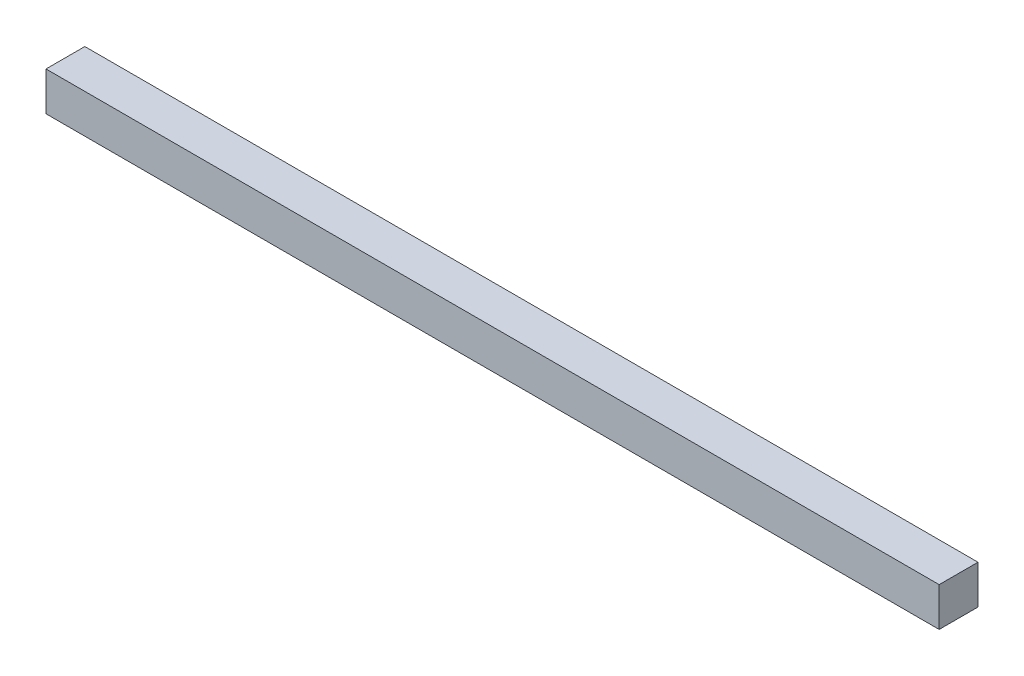
ISO-10303-21;
HEADER;
FILE_DESCRIPTION(('STEP AP214'),'2;1');
FILE_NAME('part.step','',(''),(''),'','','');
FILE_SCHEMA(('AUTOMOTIVE_DESIGN { 1 0 10303 214 1 1 1 1 }'));
ENDSEC;
DATA;
#1=APPLICATION_CONTEXT('core data for automotive mechanical design processes');
#2=APPLICATION_PROTOCOL_DEFINITION('international standard','automotive_design',2000,#1);
#3=PRODUCT_CONTEXT('',#1,'mechanical');
#4=PRODUCT('Part','Part','',(#3));
#5=PRODUCT_RELATED_PRODUCT_CATEGORY('part','',(#4));
#6=PRODUCT_DEFINITION_FORMATION('','',#4);
#7=PRODUCT_DEFINITION_CONTEXT('part definition',#1,'design');
#8=PRODUCT_DEFINITION('design','',#6,#7);
#9=PRODUCT_DEFINITION_SHAPE('','',#8);
#10=(LENGTH_UNIT() NAMED_UNIT(*) SI_UNIT(.MILLI.,.METRE.));
#11=(NAMED_UNIT(*) PLANE_ANGLE_UNIT() SI_UNIT($,.RADIAN.));
#12=(NAMED_UNIT(*) SI_UNIT($,.STERADIAN.) SOLID_ANGLE_UNIT());
#13=UNCERTAINTY_MEASURE_WITH_UNIT(LENGTH_MEASURE(1.E-05),#10,'distance_accuracy_value','');
#14=(GEOMETRIC_REPRESENTATION_CONTEXT(3) GLOBAL_UNCERTAINTY_ASSIGNED_CONTEXT((#13)) GLOBAL_UNIT_ASSIGNED_CONTEXT((#10,
#11,#12)) REPRESENTATION_CONTEXT('',''));
#15=CARTESIAN_POINT('',(0.,0.,0.));
#16=DIRECTION('',(0.,0.,1.));
#17=DIRECTION('',(1.,0.,0.));
#18=AXIS2_PLACEMENT_3D('',#15,#16,#17);
#19=CARTESIAN_POINT('',(44.0503208682354,37.6310916584124,30.));
#20=DIRECTION('',(1.,0.,0.));
#21=DIRECTION('',(0.,0.,-1.));
#22=AXIS2_PLACEMENT_3D('',#19,#20,#21);
#23=PLANE('',#22);
#24=DIRECTION('',(0.,-1.,0.));
#25=VECTOR('',#24,1.);
#26=CARTESIAN_POINT('',(44.0503208682354,37.6310916584124,0.));
#27=LINE('',#26,#25);
#28=CARTESIAN_POINT('',(44.0503208682354,37.6310916584124,0.));
#29=VERTEX_POINT('',#28);
#30=CARTESIAN_POINT('',(44.0503208682354,7.63109165841235,0.));
#31=VERTEX_POINT('',#30);
#32=EDGE_CURVE('E107',#29,#31,#27,.T.);
#33=ORIENTED_EDGE('',*,*,#32,.T.);
#34=DIRECTION('',(0.,0.,-1.));
#35=VECTOR('',#34,1.);
#36=CARTESIAN_POINT('',(44.0503208682354,7.63109165841235,30.));
#37=LINE('',#36,#35);
#38=CARTESIAN_POINT('',(44.0503208682354,7.63109165841235,30.));
#39=VERTEX_POINT('',#38);
#40=EDGE_CURVE('E11',#39,#31,#37,.T.);
#41=ORIENTED_EDGE('',*,*,#40,.F.);
#42=DIRECTION('',(0.,-1.,0.));
#43=VECTOR('',#42,1.);
#44=CARTESIAN_POINT('',(44.0503208682354,37.6310916584124,30.));
#45=LINE('',#44,#43);
#46=CARTESIAN_POINT('',(44.0503208682354,37.6310916584124,30.));
#47=VERTEX_POINT('',#46);
#48=EDGE_CURVE('E91',#47,#39,#45,.T.);
#49=ORIENTED_EDGE('',*,*,#48,.F.);
#50=DIRECTION('',(0.,0.,-1.));
#51=VECTOR('',#50,1.);
#52=CARTESIAN_POINT('',(44.0503208682354,37.6310916584124,30.));
#53=LINE('',#52,#51);
#54=EDGE_CURVE('E103',#47,#29,#53,.T.);
#55=ORIENTED_EDGE('',*,*,#54,.T.);
#56=EDGE_LOOP('',(#33,#41,#49,#55));
#57=FACE_BOUND('',#56,.T.);
#58=ADVANCED_FACE('F39',(#57),#23,.F.);
#59=CARTESIAN_POINT('',(44.0503208682354,7.63109165841235,30.));
#60=DIRECTION('',(0.,1.,0.));
#61=DIRECTION('',(0.,0.,1.));
#62=AXIS2_PLACEMENT_3D('',#59,#60,#61);
#63=PLANE('',#62);
#64=DIRECTION('',(1.,0.,0.));
#65=VECTOR('',#64,1.);
#66=CARTESIAN_POINT('',(44.0503208682354,7.63109165841235,0.));
#67=LINE('',#66,#65);
#68=CARTESIAN_POINT('',(734.050320868235,7.63109165841235,0.));
#69=VERTEX_POINT('',#68);
#70=EDGE_CURVE('E96',#31,#69,#67,.T.);
#71=ORIENTED_EDGE('',*,*,#70,.T.);
#72=DIRECTION('',(0.,0.,-1.));
#73=VECTOR('',#72,1.);
#74=CARTESIAN_POINT('',(734.050320868235,7.63109165841235,30.));
#75=LINE('',#74,#73);
#76=CARTESIAN_POINT('',(734.050320868235,7.63109165841235,30.));
#77=VERTEX_POINT('',#76);
#78=EDGE_CURVE('E48',#77,#69,#75,.T.);
#79=ORIENTED_EDGE('',*,*,#78,.F.);
#80=DIRECTION('',(1.,0.,0.));
#81=VECTOR('',#80,1.);
#82=CARTESIAN_POINT('',(44.0503208682354,7.63109165841235,30.));
#83=LINE('',#82,#81);
#84=EDGE_CURVE('E86',#39,#77,#83,.T.);
#85=ORIENTED_EDGE('',*,*,#84,.F.);
#86=ORIENTED_EDGE('',*,*,#40,.T.);
#87=EDGE_LOOP('',(#71,#79,#85,#86));
#88=FACE_BOUND('',#87,.T.);
#89=ADVANCED_FACE('F95',(#88),#63,.F.);
#90=CARTESIAN_POINT('',(734.050320868235,37.6310916584124,30.));
#91=DIRECTION('',(-1.,0.,0.));
#92=DIRECTION('',(0.,-1.,0.));
#93=AXIS2_PLACEMENT_3D('',#90,#91,#92);
#94=PLANE('',#93);
#95=DIRECTION('',(0.,1.,0.));
#96=VECTOR('',#95,1.);
#97=CARTESIAN_POINT('',(734.050320868235,37.6310916584124,0.));
#98=LINE('',#97,#96);
#99=CARTESIAN_POINT('',(734.050320868235,37.6310916584124,0.));
#100=VERTEX_POINT('',#99);
#101=EDGE_CURVE('E73',#69,#100,#98,.T.);
#102=ORIENTED_EDGE('',*,*,#101,.T.);
#103=DIRECTION('',(0.,0.,-1.));
#104=VECTOR('',#103,1.);
#105=CARTESIAN_POINT('',(734.050320868235,37.6310916584124,30.));
#106=LINE('',#105,#104);
#107=CARTESIAN_POINT('',(734.050320868235,37.6310916584124,30.));
#108=VERTEX_POINT('',#107);
#109=EDGE_CURVE('E98',#108,#100,#106,.T.);
#110=ORIENTED_EDGE('',*,*,#109,.F.);
#111=DIRECTION('',(0.,1.,0.));
#112=VECTOR('',#111,1.);
#113=CARTESIAN_POINT('',(734.050320868235,37.6310916584124,30.));
#114=LINE('',#113,#112);
#115=EDGE_CURVE('E89',#77,#108,#114,.T.);
#116=ORIENTED_EDGE('',*,*,#115,.F.);
#117=ORIENTED_EDGE('',*,*,#78,.T.);
#118=EDGE_LOOP('',(#102,#110,#116,#117));
#119=FACE_BOUND('',#118,.T.);
#120=ADVANCED_FACE('F99',(#119),#94,.F.);
#121=CARTESIAN_POINT('',(44.0503208682354,37.6310916584124,30.));
#122=DIRECTION('',(0.,-1.,0.));
#123=DIRECTION('',(0.,0.,-1.));
#124=AXIS2_PLACEMENT_3D('',#121,#122,#123);
#125=PLANE('',#124);
#126=DIRECTION('',(-1.,0.,0.));
#127=VECTOR('',#126,1.);
#128=CARTESIAN_POINT('',(44.0503208682354,37.6310916584124,0.));
#129=LINE('',#128,#127);
#130=EDGE_CURVE('E79',#100,#29,#129,.T.);
#131=ORIENTED_EDGE('',*,*,#130,.T.);
#132=ORIENTED_EDGE('',*,*,#54,.F.);
#133=DIRECTION('',(-1.,0.,0.));
#134=VECTOR('',#133,1.);
#135=CARTESIAN_POINT('',(44.0503208682354,37.6310916584124,30.));
#136=LINE('',#135,#134);
#137=EDGE_CURVE('E56',#108,#47,#136,.T.);
#138=ORIENTED_EDGE('',*,*,#137,.F.);
#139=ORIENTED_EDGE('',*,*,#109,.T.);
#140=EDGE_LOOP('',(#131,#132,#138,#139));
#141=FACE_BOUND('',#140,.T.);
#142=ADVANCED_FACE('F120',(#141),#125,.F.);
#143=CARTESIAN_POINT('',(0.,0.,30.));
#144=DIRECTION('',(0.,0.,1.));
#145=DIRECTION('',(1.,0.,0.));
#146=AXIS2_PLACEMENT_3D('',#143,#144,#145);
#147=PLANE('',#146);
#148=ORIENTED_EDGE('',*,*,#48,.T.);
#149=ORIENTED_EDGE('',*,*,#84,.T.);
#150=ORIENTED_EDGE('',*,*,#115,.T.);
#151=ORIENTED_EDGE('',*,*,#137,.T.);
#152=EDGE_LOOP('',(#148,#149,#150,#151));
#153=FACE_BOUND('',#152,.T.);
#154=ADVANCED_FACE('F87',(#153),#147,.T.);
#155=CARTESIAN_POINT('',(0.,0.,0.));
#156=DIRECTION('',(0.,0.,1.));
#157=DIRECTION('',(1.,0.,0.));
#158=AXIS2_PLACEMENT_3D('',#155,#156,#157);
#159=PLANE('',#158);
#160=ORIENTED_EDGE('',*,*,#32,.F.);
#161=ORIENTED_EDGE('',*,*,#130,.F.);
#162=ORIENTED_EDGE('',*,*,#101,.F.);
#163=ORIENTED_EDGE('',*,*,#70,.F.);
#164=EDGE_LOOP('',(#160,#161,#162,#163));
#165=FACE_BOUND('',#164,.T.);
#166=ADVANCED_FACE('F123',(#165),#159,.F.);
#167=CLOSED_SHELL('',(#58,#89,#120,#142,#154,#166));
#168=MANIFOLD_SOLID_BREP('B2',#167);
#169=ADVANCED_BREP_SHAPE_REPRESENTATION('',(#18,#168),#14);
#170=SHAPE_DEFINITION_REPRESENTATION(#9,#169);
ENDSEC;
END-ISO-10303-21;
